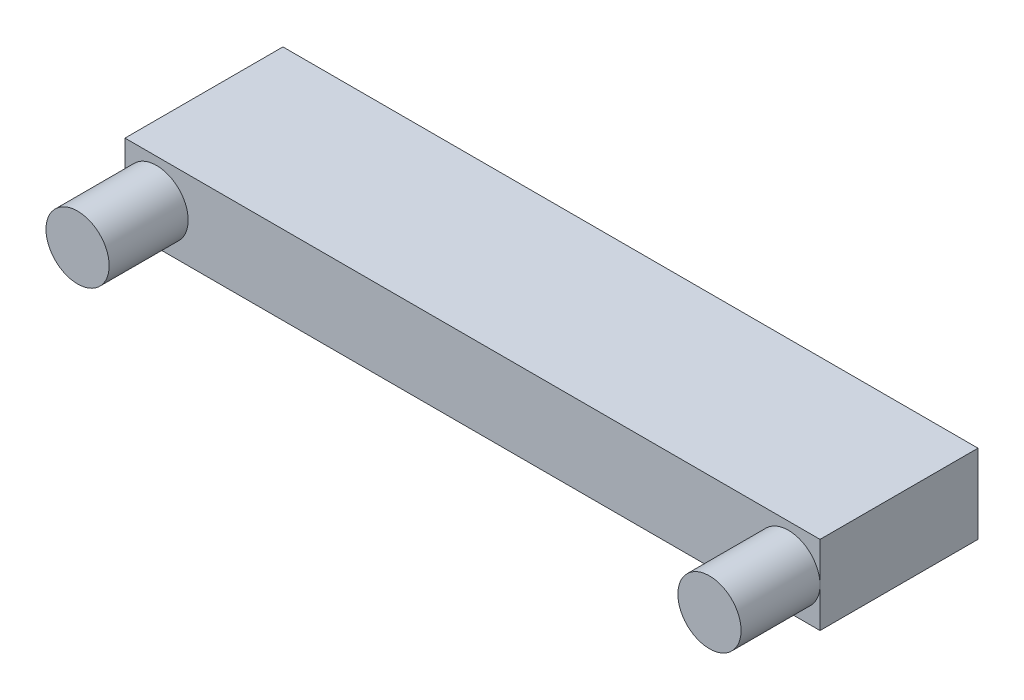
ISO-10303-21;
HEADER;
FILE_DESCRIPTION(('STEP AP214'),'2;1');
FILE_NAME('part.step','',(''),(''),'','','');
FILE_SCHEMA(('AUTOMOTIVE_DESIGN { 1 0 10303 214 1 1 1 1 }'));
ENDSEC;
DATA;
#1=APPLICATION_CONTEXT('core data for automotive mechanical design processes');
#2=APPLICATION_PROTOCOL_DEFINITION('international standard','automotive_design',2000,#1);
#3=PRODUCT_CONTEXT('',#1,'mechanical');
#4=PRODUCT('Part','Part','',(#3));
#5=PRODUCT_RELATED_PRODUCT_CATEGORY('part','',(#4));
#6=PRODUCT_DEFINITION_FORMATION('','',#4);
#7=PRODUCT_DEFINITION_CONTEXT('part definition',#1,'design');
#8=PRODUCT_DEFINITION('design','',#6,#7);
#9=PRODUCT_DEFINITION_SHAPE('','',#8);
#10=(LENGTH_UNIT() NAMED_UNIT(*) SI_UNIT(.MILLI.,.METRE.));
#11=(NAMED_UNIT(*) PLANE_ANGLE_UNIT() SI_UNIT($,.RADIAN.));
#12=(NAMED_UNIT(*) SI_UNIT($,.STERADIAN.) SOLID_ANGLE_UNIT());
#13=UNCERTAINTY_MEASURE_WITH_UNIT(LENGTH_MEASURE(1.E-05),#10,'distance_accuracy_value','');
#14=(GEOMETRIC_REPRESENTATION_CONTEXT(3) GLOBAL_UNCERTAINTY_ASSIGNED_CONTEXT((#13)) GLOBAL_UNIT_ASSIGNED_CONTEXT((#10,
#11,#12)) REPRESENTATION_CONTEXT('',''));
#15=CARTESIAN_POINT('',(0.,0.,0.));
#16=DIRECTION('',(0.,0.,1.));
#17=DIRECTION('',(1.,0.,0.));
#18=AXIS2_PLACEMENT_3D('',#15,#16,#17);
#19=CARTESIAN_POINT('',(0.,0.,10.));
#20=DIRECTION('',(0.,0.,-1.));
#21=DIRECTION('',(-1.,0.,0.));
#22=AXIS2_PLACEMENT_3D('',#19,#20,#21);
#23=PLANE('',#22);
#24=DIRECTION('',(0.,1.,0.));
#25=VECTOR('',#24,1.);
#26=CARTESIAN_POINT('',(22.,-2.5,10.));
#27=LINE('',#26,#25);
#28=CARTESIAN_POINT('',(22.,-2.5,10.));
#29=VERTEX_POINT('',#28);
#30=CARTESIAN_POINT('',(22.,0.,10.));
#31=VERTEX_POINT('',#30);
#32=EDGE_CURVE('E88',#29,#31,#27,.T.);
#33=ORIENTED_EDGE('',*,*,#32,.T.);
#34=CARTESIAN_POINT('',(20.,0.,10.));
#35=DIRECTION('',(0.,0.,1.));
#36=DIRECTION('',(1.,0.,0.));
#37=AXIS2_PLACEMENT_3D('',#34,#35,#36);
#38=CIRCLE('',#37,2.);
#39=EDGE_CURVE('E90',#31,#31,#38,.T.);
#40=ORIENTED_EDGE('',*,*,#39,.F.);
#41=CARTESIAN_POINT('',(22.,2.5,10.));
#42=VERTEX_POINT('',#41);
#43=EDGE_CURVE('E81',#31,#42,#27,.T.);
#44=ORIENTED_EDGE('',*,*,#43,.T.);
#45=DIRECTION('',(-1.,0.,0.));
#46=VECTOR('',#45,1.);
#47=CARTESIAN_POINT('',(-22.,2.5,10.));
#48=LINE('',#47,#46);
#49=CARTESIAN_POINT('',(-22.,2.5,10.));
#50=VERTEX_POINT('',#49);
#51=EDGE_CURVE('E92',#42,#50,#48,.T.);
#52=ORIENTED_EDGE('',*,*,#51,.T.);
#53=DIRECTION('',(0.,-1.,0.));
#54=VECTOR('',#53,1.);
#55=CARTESIAN_POINT('',(-22.,-2.5,10.));
#56=LINE('',#55,#54);
#57=CARTESIAN_POINT('',(-22.,0.,10.));
#58=VERTEX_POINT('',#57);
#59=EDGE_CURVE('E103',#50,#58,#56,.T.);
#60=ORIENTED_EDGE('',*,*,#59,.T.);
#61=CARTESIAN_POINT('',(-20.,0.,10.));
#62=DIRECTION('',(0.,0.,1.));
#63=DIRECTION('',(1.,0.,0.));
#64=AXIS2_PLACEMENT_3D('',#61,#62,#63);
#65=CIRCLE('',#64,2.);
#66=EDGE_CURVE('E99',#58,#58,#65,.T.);
#67=ORIENTED_EDGE('',*,*,#66,.F.);
#68=CARTESIAN_POINT('',(-22.,-2.5,10.));
#69=VERTEX_POINT('',#68);
#70=EDGE_CURVE('E102',#58,#69,#56,.T.);
#71=ORIENTED_EDGE('',*,*,#70,.T.);
#72=DIRECTION('',(1.,0.,0.));
#73=VECTOR('',#72,1.);
#74=CARTESIAN_POINT('',(-22.,-2.5,10.));
#75=LINE('',#74,#73);
#76=EDGE_CURVE('E50',#69,#29,#75,.T.);
#77=ORIENTED_EDGE('',*,*,#76,.T.);
#78=EDGE_LOOP('',(#33,#40,#44,#52,#60,#67,#71,#77));
#79=FACE_BOUND('',#78,.T.);
#80=ADVANCED_FACE('F33',(#79),#23,.F.);
#81=CARTESIAN_POINT('',(22.,-2.5,10.));
#82=DIRECTION('',(-1.,0.,0.));
#83=DIRECTION('',(0.,0.,1.));
#84=AXIS2_PLACEMENT_3D('',#81,#82,#83);
#85=PLANE('',#84);
#86=DIRECTION('',(0.,1.,0.));
#87=VECTOR('',#86,1.);
#88=CARTESIAN_POINT('',(22.,-2.5,0.));
#89=LINE('',#88,#87);
#90=CARTESIAN_POINT('',(22.,-2.5,0.));
#91=VERTEX_POINT('',#90);
#92=CARTESIAN_POINT('',(22.,2.5,0.));
#93=VERTEX_POINT('',#92);
#94=EDGE_CURVE('E107',#91,#93,#89,.T.);
#95=ORIENTED_EDGE('',*,*,#94,.T.);
#96=DIRECTION('',(0.,0.,-1.));
#97=VECTOR('',#96,1.);
#98=CARTESIAN_POINT('',(22.,2.5,10.));
#99=LINE('',#98,#97);
#100=EDGE_CURVE('E11',#42,#93,#99,.T.);
#101=ORIENTED_EDGE('',*,*,#100,.F.);
#102=ORIENTED_EDGE('',*,*,#43,.F.);
#103=ORIENTED_EDGE('',*,*,#32,.F.);
#104=DIRECTION('',(0.,0.,-1.));
#105=VECTOR('',#104,1.);
#106=CARTESIAN_POINT('',(22.,-2.5,10.));
#107=LINE('',#106,#105);
#108=EDGE_CURVE('E106',#29,#91,#107,.T.);
#109=ORIENTED_EDGE('',*,*,#108,.T.);
#110=EDGE_LOOP('',(#95,#101,#102,#103,#109));
#111=FACE_BOUND('',#110,.T.);
#112=ADVANCED_FACE('F35',(#111),#85,.F.);
#113=CARTESIAN_POINT('',(-22.,2.5,10.));
#114=DIRECTION('',(0.,-1.,0.));
#115=DIRECTION('',(0.,0.,-1.));
#116=AXIS2_PLACEMENT_3D('',#113,#114,#115);
#117=PLANE('',#116);
#118=DIRECTION('',(-1.,0.,0.));
#119=VECTOR('',#118,1.);
#120=CARTESIAN_POINT('',(-22.,2.5,0.));
#121=LINE('',#120,#119);
#122=CARTESIAN_POINT('',(-22.,2.5,0.));
#123=VERTEX_POINT('',#122);
#124=EDGE_CURVE('E109',#93,#123,#121,.T.);
#125=ORIENTED_EDGE('',*,*,#124,.T.);
#126=DIRECTION('',(0.,0.,-1.));
#127=VECTOR('',#126,1.);
#128=CARTESIAN_POINT('',(-22.,2.5,10.));
#129=LINE('',#128,#127);
#130=EDGE_CURVE('E42',#50,#123,#129,.T.);
#131=ORIENTED_EDGE('',*,*,#130,.F.);
#132=ORIENTED_EDGE('',*,*,#51,.F.);
#133=ORIENTED_EDGE('',*,*,#100,.T.);
#134=EDGE_LOOP('',(#125,#131,#132,#133));
#135=FACE_BOUND('',#134,.T.);
#136=ADVANCED_FACE('F154',(#135),#117,.F.);
#137=CARTESIAN_POINT('',(-22.,-2.5,10.));
#138=DIRECTION('',(1.,0.,0.));
#139=DIRECTION('',(0.,0.,-1.));
#140=AXIS2_PLACEMENT_3D('',#137,#138,#139);
#141=PLANE('',#140);
#142=DIRECTION('',(0.,-1.,0.));
#143=VECTOR('',#142,1.);
#144=CARTESIAN_POINT('',(-22.,-2.5,0.));
#145=LINE('',#144,#143);
#146=CARTESIAN_POINT('',(-22.,-2.5,0.));
#147=VERTEX_POINT('',#146);
#148=EDGE_CURVE('E68',#123,#147,#145,.T.);
#149=ORIENTED_EDGE('',*,*,#148,.T.);
#150=DIRECTION('',(0.,0.,-1.));
#151=VECTOR('',#150,1.);
#152=CARTESIAN_POINT('',(-22.,-2.5,10.));
#153=LINE('',#152,#151);
#154=EDGE_CURVE('E114',#69,#147,#153,.T.);
#155=ORIENTED_EDGE('',*,*,#154,.F.);
#156=ORIENTED_EDGE('',*,*,#70,.F.);
#157=ORIENTED_EDGE('',*,*,#59,.F.);
#158=ORIENTED_EDGE('',*,*,#130,.T.);
#159=EDGE_LOOP('',(#149,#155,#156,#157,#158));
#160=FACE_BOUND('',#159,.T.);
#161=ADVANCED_FACE('F117',(#160),#141,.F.);
#162=CARTESIAN_POINT('',(-22.,-2.5,10.));
#163=DIRECTION('',(0.,1.,0.));
#164=DIRECTION('',(0.,0.,1.));
#165=AXIS2_PLACEMENT_3D('',#162,#163,#164);
#166=PLANE('',#165);
#167=DIRECTION('',(1.,0.,0.));
#168=VECTOR('',#167,1.);
#169=CARTESIAN_POINT('',(-22.,-2.5,0.));
#170=LINE('',#169,#168);
#171=EDGE_CURVE('E74',#147,#91,#170,.T.);
#172=ORIENTED_EDGE('',*,*,#171,.T.);
#173=ORIENTED_EDGE('',*,*,#108,.F.);
#174=ORIENTED_EDGE('',*,*,#76,.F.);
#175=ORIENTED_EDGE('',*,*,#154,.T.);
#176=EDGE_LOOP('',(#172,#173,#174,#175));
#177=FACE_BOUND('',#176,.T.);
#178=ADVANCED_FACE('F123',(#177),#166,.F.);
#179=CARTESIAN_POINT('',(0.,0.,0.));
#180=DIRECTION('',(0.,0.,-1.));
#181=DIRECTION('',(-1.,0.,0.));
#182=AXIS2_PLACEMENT_3D('',#179,#180,#181);
#183=PLANE('',#182);
#184=ORIENTED_EDGE('',*,*,#94,.F.);
#185=ORIENTED_EDGE('',*,*,#171,.F.);
#186=ORIENTED_EDGE('',*,*,#148,.F.);
#187=ORIENTED_EDGE('',*,*,#124,.F.);
#188=EDGE_LOOP('',(#184,#185,#186,#187));
#189=FACE_BOUND('',#188,.T.);
#190=ADVANCED_FACE('F122',(#189),#183,.T.);
#191=CARTESIAN_POINT('',(-20.,0.,15.));
#192=DIRECTION('',(0.,0.,-1.));
#193=DIRECTION('',(-1.,0.,0.));
#194=AXIS2_PLACEMENT_3D('',#191,#192,#193);
#195=CYLINDRICAL_SURFACE('',#194,2.);
#196=CARTESIAN_POINT('',(-20.,0.,15.));
#197=DIRECTION('',(0.,0.,1.));
#198=DIRECTION('',(1.,0.,0.));
#199=AXIS2_PLACEMENT_3D('',#196,#197,#198);
#200=CIRCLE('',#199,2.);
#201=CARTESIAN_POINT('',(-18.,0.,15.));
#202=VERTEX_POINT('',#201);
#203=EDGE_CURVE('E110',#202,#202,#200,.T.);
#204=ORIENTED_EDGE('',*,*,#203,.F.);
#205=EDGE_LOOP('',(#204));
#206=FACE_BOUND('',#205,.T.);
#207=ORIENTED_EDGE('',*,*,#66,.T.);
#208=EDGE_LOOP('',(#207));
#209=FACE_BOUND('',#208,.T.);
#210=ADVANCED_FACE('F146',(#206,#209),#195,.T.);
#211=CARTESIAN_POINT('',(-20.,0.,15.));
#212=DIRECTION('',(0.,0.,1.));
#213=DIRECTION('',(1.,0.,0.));
#214=AXIS2_PLACEMENT_3D('',#211,#212,#213);
#215=PLANE('',#214);
#216=ORIENTED_EDGE('',*,*,#203,.T.);
#217=EDGE_LOOP('',(#216));
#218=FACE_BOUND('',#217,.T.);
#219=ADVANCED_FACE('F138',(#218),#215,.T.);
#220=CARTESIAN_POINT('',(20.,0.,15.));
#221=DIRECTION('',(0.,0.,-1.));
#222=DIRECTION('',(-1.,0.,0.));
#223=AXIS2_PLACEMENT_3D('',#220,#221,#222);
#224=CYLINDRICAL_SURFACE('',#223,2.);
#225=CARTESIAN_POINT('',(20.,0.,15.));
#226=DIRECTION('',(0.,0.,1.));
#227=DIRECTION('',(1.,0.,0.));
#228=AXIS2_PLACEMENT_3D('',#225,#226,#227);
#229=CIRCLE('',#228,2.);
#230=CARTESIAN_POINT('',(22.,0.,15.));
#231=VERTEX_POINT('',#230);
#232=EDGE_CURVE('E127',#231,#231,#229,.T.);
#233=ORIENTED_EDGE('',*,*,#232,.F.);
#234=EDGE_LOOP('',(#233));
#235=FACE_BOUND('',#234,.T.);
#236=ORIENTED_EDGE('',*,*,#39,.T.);
#237=EDGE_LOOP('',(#236));
#238=FACE_BOUND('',#237,.T.);
#239=ADVANCED_FACE('F135',(#235,#238),#224,.T.);
#240=CARTESIAN_POINT('',(20.,0.,15.));
#241=DIRECTION('',(0.,0.,1.));
#242=DIRECTION('',(1.,0.,0.));
#243=AXIS2_PLACEMENT_3D('',#240,#241,#242);
#244=PLANE('',#243);
#245=ORIENTED_EDGE('',*,*,#232,.T.);
#246=EDGE_LOOP('',(#245));
#247=FACE_BOUND('',#246,.T.);
#248=ADVANCED_FACE('F137',(#247),#244,.T.);
#249=CLOSED_SHELL('',(#80,#112,#136,#161,#178,#190,#210,#219,#239,#248));
#250=MANIFOLD_SOLID_BREP('B2',#249);
#251=ADVANCED_BREP_SHAPE_REPRESENTATION('',(#18,#250),#14);
#252=SHAPE_DEFINITION_REPRESENTATION(#9,#251);
ENDSEC;
END-ISO-10303-21;
